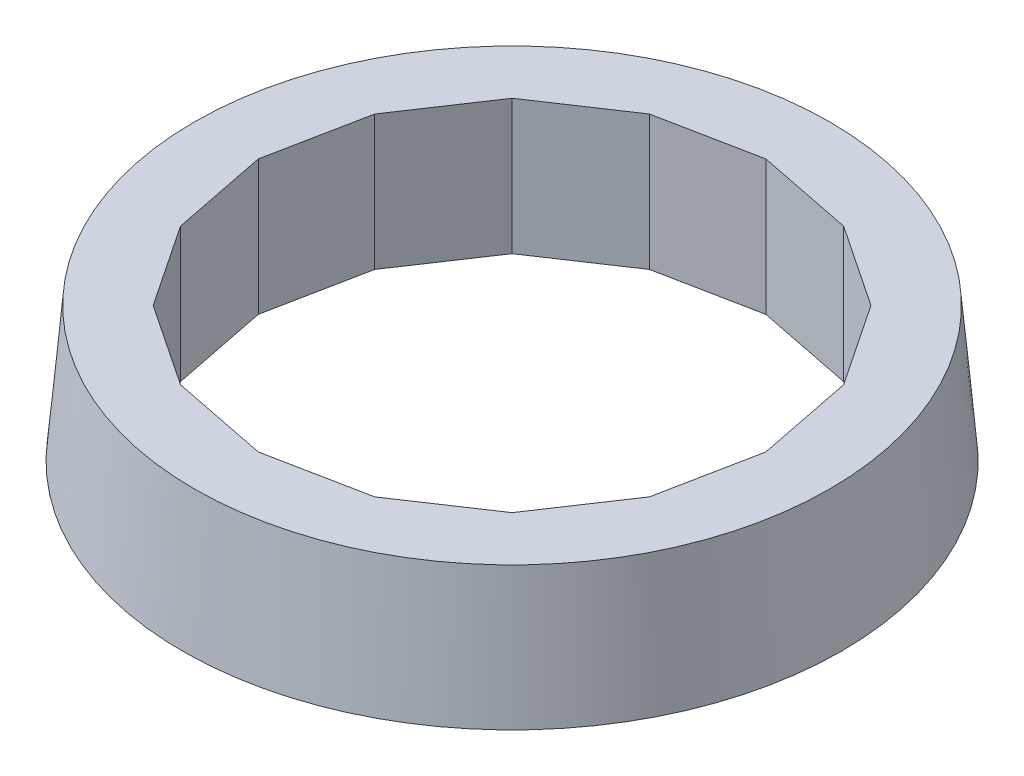
ISO-10303-21;
HEADER;
FILE_DESCRIPTION(('STEP AP214'),'2;1');
FILE_NAME('part.step','',(''),(''),'','','');
FILE_SCHEMA(('AUTOMOTIVE_DESIGN { 1 0 10303 214 1 1 1 1 }'));
ENDSEC;
DATA;
#1=APPLICATION_CONTEXT('core data for automotive mechanical design processes');
#2=APPLICATION_PROTOCOL_DEFINITION('international standard','automotive_design',2000,#1);
#3=PRODUCT_CONTEXT('',#1,'mechanical');
#4=PRODUCT('Part','Part','',(#3));
#5=PRODUCT_RELATED_PRODUCT_CATEGORY('part','',(#4));
#6=PRODUCT_DEFINITION_FORMATION('','',#4);
#7=PRODUCT_DEFINITION_CONTEXT('part definition',#1,'design');
#8=PRODUCT_DEFINITION('design','',#6,#7);
#9=PRODUCT_DEFINITION_SHAPE('','',#8);
#10=(LENGTH_UNIT() NAMED_UNIT(*) SI_UNIT(.MILLI.,.METRE.));
#11=(NAMED_UNIT(*) PLANE_ANGLE_UNIT() SI_UNIT($,.RADIAN.));
#12=(NAMED_UNIT(*) SI_UNIT($,.STERADIAN.) SOLID_ANGLE_UNIT());
#13=UNCERTAINTY_MEASURE_WITH_UNIT(LENGTH_MEASURE(1.E-05),#10,'distance_accuracy_value','');
#14=(GEOMETRIC_REPRESENTATION_CONTEXT(3) GLOBAL_UNCERTAINTY_ASSIGNED_CONTEXT((#13)) GLOBAL_UNIT_ASSIGNED_CONTEXT((#10,
#11,#12)) REPRESENTATION_CONTEXT('',''));
#15=CARTESIAN_POINT('',(0.,0.,0.));
#16=DIRECTION('',(0.,0.,1.));
#17=DIRECTION('',(1.,0.,0.));
#18=AXIS2_PLACEMENT_3D('',#15,#16,#17);
#19=CARTESIAN_POINT('',(0.,19.05,0.));
#20=DIRECTION('',(0.,1.,0.));
#21=DIRECTION('',(0.,0.,1.));
#22=AXIS2_PLACEMENT_3D('',#19,#20,#21);
#23=PLANE('',#22);
#24=DIRECTION('',(0.195090322016129,0.,0.98078528040323));
#25=VECTOR('',#24,1.);
#26=CARTESIAN_POINT('',(-35.9101329528706,19.05,0.));
#27=LINE('',#26,#25);
#28=CARTESIAN_POINT('',(-35.9101329528706,19.05,0.));
#29=VERTEX_POINT('',#28);
#30=CARTESIAN_POINT('',(-33.1766368449163,19.05,13.7422129350912));
#31=VERTEX_POINT('',#30);
#32=EDGE_CURVE('E155',#29,#31,#27,.T.);
#33=ORIENTED_EDGE('',*,*,#32,.F.);
#34=DIRECTION('',(-0.195090322016128,0.,0.980785280403231));
#35=VECTOR('',#34,1.);
#36=CARTESIAN_POINT('',(-33.1766368449163,19.05,-13.7422129350913));
#37=LINE('',#36,#35);
#38=CARTESIAN_POINT('',(-33.1766368449163,19.05,-13.7422129350913));
#39=VERTEX_POINT('',#38);
#40=EDGE_CURVE('E147',#39,#29,#37,.T.);
#41=ORIENTED_EDGE('',*,*,#40,.F.);
#42=DIRECTION('',(-0.555570233019603,0.,0.831469612302545));
#43=VECTOR('',#42,1.);
#44=CARTESIAN_POINT('',(-25.3922985242853,19.05,-25.3922985242853));
#45=LINE('',#44,#43);
#46=CARTESIAN_POINT('',(-25.3922985242853,19.05,-25.3922985242853));
#47=VERTEX_POINT('',#46);
#48=EDGE_CURVE('E196',#47,#39,#45,.T.);
#49=ORIENTED_EDGE('',*,*,#48,.F.);
#50=DIRECTION('',(-0.831469612302545,0.,0.555570233019602));
#51=VECTOR('',#50,1.);
#52=CARTESIAN_POINT('',(-13.7422129350912,19.05,-33.1766368449163));
#53=LINE('',#52,#51);
#54=CARTESIAN_POINT('',(-13.7422129350912,19.05,-33.1766368449163));
#55=VERTEX_POINT('',#54);
#56=EDGE_CURVE('E194',#55,#47,#53,.T.);
#57=ORIENTED_EDGE('',*,*,#56,.F.);
#58=DIRECTION('',(-0.98078528040323,0.,0.195090322016128));
#59=VECTOR('',#58,1.);
#60=CARTESIAN_POINT('',(0.,19.05,-35.9101329528706));
#61=LINE('',#60,#59);
#62=CARTESIAN_POINT('',(0.,19.05,-35.9101329528706));
#63=VERTEX_POINT('',#62);
#64=EDGE_CURVE('E192',#63,#55,#61,.T.);
#65=ORIENTED_EDGE('',*,*,#64,.F.);
#66=DIRECTION('',(-0.98078528040323,0.,-0.195090322016128));
#67=VECTOR('',#66,1.);
#68=CARTESIAN_POINT('',(13.7422129350912,19.05,-33.1766368449163));
#69=LINE('',#68,#67);
#70=CARTESIAN_POINT('',(13.7422129350912,19.05,-33.1766368449163));
#71=VERTEX_POINT('',#70);
#72=EDGE_CURVE('E190',#71,#63,#69,.T.);
#73=ORIENTED_EDGE('',*,*,#72,.F.);
#74=DIRECTION('',(-0.831469612302545,0.,-0.555570233019602));
#75=VECTOR('',#74,1.);
#76=CARTESIAN_POINT('',(25.3922985242853,19.05,-25.3922985242853));
#77=LINE('',#76,#75);
#78=CARTESIAN_POINT('',(25.3922985242853,19.05,-25.3922985242853));
#79=VERTEX_POINT('',#78);
#80=EDGE_CURVE('E188',#79,#71,#77,.T.);
#81=ORIENTED_EDGE('',*,*,#80,.F.);
#82=DIRECTION('',(-0.555570233019602,0.,-0.831469612302545));
#83=VECTOR('',#82,1.);
#84=CARTESIAN_POINT('',(33.1766368449163,19.05,-13.7422129350912));
#85=LINE('',#84,#83);
#86=CARTESIAN_POINT('',(33.1766368449163,19.05,-13.7422129350912));
#87=VERTEX_POINT('',#86);
#88=EDGE_CURVE('E186',#87,#79,#85,.T.);
#89=ORIENTED_EDGE('',*,*,#88,.F.);
#90=DIRECTION('',(-0.195090322016128,0.,-0.980785280403231));
#91=VECTOR('',#90,1.);
#92=CARTESIAN_POINT('',(35.9101329528706,19.05,0.));
#93=LINE('',#92,#91);
#94=CARTESIAN_POINT('',(35.9101329528706,19.05,0.));
#95=VERTEX_POINT('',#94);
#96=EDGE_CURVE('E184',#95,#87,#93,.T.);
#97=ORIENTED_EDGE('',*,*,#96,.F.);
#98=DIRECTION('',(0.195090322016128,0.,-0.980785280403231));
#99=VECTOR('',#98,1.);
#100=CARTESIAN_POINT('',(33.1766368449163,19.05,13.7422129350912));
#101=LINE('',#100,#99);
#102=CARTESIAN_POINT('',(33.1766368449163,19.05,13.7422129350912));
#103=VERTEX_POINT('',#102);
#104=EDGE_CURVE('E182',#103,#95,#101,.T.);
#105=ORIENTED_EDGE('',*,*,#104,.F.);
#106=DIRECTION('',(0.555570233019603,0.,-0.831469612302545));
#107=VECTOR('',#106,1.);
#108=CARTESIAN_POINT('',(25.3922985242853,19.05,25.3922985242853));
#109=LINE('',#108,#107);
#110=CARTESIAN_POINT('',(25.3922985242853,19.05,25.3922985242853));
#111=VERTEX_POINT('',#110);
#112=EDGE_CURVE('E180',#111,#103,#109,.T.);
#113=ORIENTED_EDGE('',*,*,#112,.F.);
#114=DIRECTION('',(0.831469612302545,0.,-0.555570233019603));
#115=VECTOR('',#114,1.);
#116=CARTESIAN_POINT('',(13.7422129350913,19.05,33.1766368449163));
#117=LINE('',#116,#115);
#118=CARTESIAN_POINT('',(13.7422129350913,19.05,33.1766368449163));
#119=VERTEX_POINT('',#118);
#120=EDGE_CURVE('E178',#119,#111,#117,.T.);
#121=ORIENTED_EDGE('',*,*,#120,.F.);
#122=DIRECTION('',(0.98078528040323,0.,-0.195090322016128));
#123=VECTOR('',#122,1.);
#124=CARTESIAN_POINT('',(0.,19.05,35.9101329528706));
#125=LINE('',#124,#123);
#126=CARTESIAN_POINT('',(0.,19.05,35.9101329528706));
#127=VERTEX_POINT('',#126);
#128=EDGE_CURVE('E176',#127,#119,#125,.T.);
#129=ORIENTED_EDGE('',*,*,#128,.F.);
#130=DIRECTION('',(0.980785280403231,0.,0.195090322016128));
#131=VECTOR('',#130,1.);
#132=CARTESIAN_POINT('',(-13.7422129350912,19.05,33.1766368449163));
#133=LINE('',#132,#131);
#134=CARTESIAN_POINT('',(-13.7422129350912,19.05,33.1766368449163));
#135=VERTEX_POINT('',#134);
#136=EDGE_CURVE('E174',#135,#127,#133,.T.);
#137=ORIENTED_EDGE('',*,*,#136,.F.);
#138=DIRECTION('',(0.831469612302545,0.,0.555570233019602));
#139=VECTOR('',#138,1.);
#140=CARTESIAN_POINT('',(-25.3922985242853,19.05,25.3922985242853));
#141=LINE('',#140,#139);
#142=CARTESIAN_POINT('',(-25.3922985242853,19.05,25.3922985242853));
#143=VERTEX_POINT('',#142);
#144=EDGE_CURVE('E169',#143,#135,#141,.T.);
#145=ORIENTED_EDGE('',*,*,#144,.F.);
#146=DIRECTION('',(0.555570233019602,0.,0.831469612302545));
#147=VECTOR('',#146,1.);
#148=CARTESIAN_POINT('',(-33.1766368449163,19.05,13.7422129350912));
#149=LINE('',#148,#147);
#150=EDGE_CURVE('E166',#31,#143,#149,.T.);
#151=ORIENTED_EDGE('',*,*,#150,.F.);
#152=EDGE_LOOP('',(#33,#41,#49,#57,#65,#73,#81,#89,#97,#105,#113,#121,#129,#137,#145,#151));
#153=FACE_BOUND('',#152,.T.);
#154=CARTESIAN_POINT('',(0.,19.05,0.));
#155=DIRECTION('',(0.,1.,0.));
#156=DIRECTION('',(0.,0.,1.));
#157=AXIS2_PLACEMENT_3D('',#154,#155,#156);
#158=CIRCLE('',#157,44.9700969892014);
#159=CARTESIAN_POINT('',(0.,19.05,44.9700969892013));
#160=VERTEX_POINT('',#159);
#161=EDGE_CURVE('E199',#160,#160,#158,.T.);
#162=ORIENTED_EDGE('',*,*,#161,.T.);
#163=EDGE_LOOP('',(#162));
#164=FACE_BOUND('',#163,.T.);
#165=ADVANCED_FACE('F35',(#153,#164),#23,.T.);
#166=CARTESIAN_POINT('',(0.,0.,0.));
#167=DIRECTION('',(0.,1.,0.));
#168=DIRECTION('',(0.,0.,1.));
#169=AXIS2_PLACEMENT_3D('',#166,#167,#168);
#170=PLANE('',#169);
#171=DIRECTION('',(-0.195090322016128,0.,0.980785280403231));
#172=VECTOR('',#171,1.);
#173=CARTESIAN_POINT('',(-33.1766368449163,0.,-13.7422129350913));
#174=LINE('',#173,#172);
#175=CARTESIAN_POINT('',(-33.1766368449163,0.,-13.7422129350913));
#176=VERTEX_POINT('',#175);
#177=CARTESIAN_POINT('',(-35.9101329528706,0.,0.));
#178=VERTEX_POINT('',#177);
#179=EDGE_CURVE('E57',#176,#178,#174,.T.);
#180=ORIENTED_EDGE('',*,*,#179,.T.);
#181=DIRECTION('',(0.195090322016129,0.,0.98078528040323));
#182=VECTOR('',#181,1.);
#183=CARTESIAN_POINT('',(-35.9101329528706,0.,0.));
#184=LINE('',#183,#182);
#185=CARTESIAN_POINT('',(-33.1766368449163,0.,13.7422129350912));
#186=VERTEX_POINT('',#185);
#187=EDGE_CURVE('E162',#178,#186,#184,.T.);
#188=ORIENTED_EDGE('',*,*,#187,.T.);
#189=DIRECTION('',(0.555570233019602,0.,0.831469612302545));
#190=VECTOR('',#189,1.);
#191=CARTESIAN_POINT('',(-33.1766368449163,0.,13.7422129350912));
#192=LINE('',#191,#190);
#193=CARTESIAN_POINT('',(-25.3922985242853,0.,25.3922985242853));
#194=VERTEX_POINT('',#193);
#195=EDGE_CURVE('E202',#186,#194,#192,.T.);
#196=ORIENTED_EDGE('',*,*,#195,.T.);
#197=DIRECTION('',(0.831469612302545,0.,0.555570233019602));
#198=VECTOR('',#197,1.);
#199=CARTESIAN_POINT('',(-25.3922985242853,0.,25.3922985242853));
#200=LINE('',#199,#198);
#201=CARTESIAN_POINT('',(-13.7422129350912,0.,33.1766368449163));
#202=VERTEX_POINT('',#201);
#203=EDGE_CURVE('E205',#194,#202,#200,.T.);
#204=ORIENTED_EDGE('',*,*,#203,.T.);
#205=DIRECTION('',(0.980785280403231,0.,0.195090322016128));
#206=VECTOR('',#205,1.);
#207=CARTESIAN_POINT('',(-13.7422129350912,0.,33.1766368449163));
#208=LINE('',#207,#206);
#209=CARTESIAN_POINT('',(0.,0.,35.9101329528706));
#210=VERTEX_POINT('',#209);
#211=EDGE_CURVE('E208',#202,#210,#208,.T.);
#212=ORIENTED_EDGE('',*,*,#211,.T.);
#213=DIRECTION('',(0.98078528040323,0.,-0.195090322016128));
#214=VECTOR('',#213,1.);
#215=CARTESIAN_POINT('',(0.,0.,35.9101329528706));
#216=LINE('',#215,#214);
#217=CARTESIAN_POINT('',(13.7422129350913,0.,33.1766368449163));
#218=VERTEX_POINT('',#217);
#219=EDGE_CURVE('E211',#210,#218,#216,.T.);
#220=ORIENTED_EDGE('',*,*,#219,.T.);
#221=DIRECTION('',(0.831469612302545,0.,-0.555570233019603));
#222=VECTOR('',#221,1.);
#223=CARTESIAN_POINT('',(13.7422129350913,0.,33.1766368449163));
#224=LINE('',#223,#222);
#225=CARTESIAN_POINT('',(25.3922985242853,0.,25.3922985242853));
#226=VERTEX_POINT('',#225);
#227=EDGE_CURVE('E215',#218,#226,#224,.T.);
#228=ORIENTED_EDGE('',*,*,#227,.T.);
#229=DIRECTION('',(0.555570233019603,0.,-0.831469612302545));
#230=VECTOR('',#229,1.);
#231=CARTESIAN_POINT('',(25.3922985242853,0.,25.3922985242853));
#232=LINE('',#231,#230);
#233=CARTESIAN_POINT('',(33.1766368449163,0.,13.7422129350912));
#234=VERTEX_POINT('',#233);
#235=EDGE_CURVE('E218',#226,#234,#232,.T.);
#236=ORIENTED_EDGE('',*,*,#235,.T.);
#237=DIRECTION('',(0.195090322016128,0.,-0.980785280403231));
#238=VECTOR('',#237,1.);
#239=CARTESIAN_POINT('',(33.1766368449163,0.,13.7422129350912));
#240=LINE('',#239,#238);
#241=CARTESIAN_POINT('',(35.9101329528706,0.,0.));
#242=VERTEX_POINT('',#241);
#243=EDGE_CURVE('E221',#234,#242,#240,.T.);
#244=ORIENTED_EDGE('',*,*,#243,.T.);
#245=DIRECTION('',(-0.195090322016128,0.,-0.980785280403231));
#246=VECTOR('',#245,1.);
#247=CARTESIAN_POINT('',(35.9101329528706,0.,0.));
#248=LINE('',#247,#246);
#249=CARTESIAN_POINT('',(33.1766368449163,0.,-13.7422129350912));
#250=VERTEX_POINT('',#249);
#251=EDGE_CURVE('E224',#242,#250,#248,.T.);
#252=ORIENTED_EDGE('',*,*,#251,.T.);
#253=DIRECTION('',(-0.555570233019602,0.,-0.831469612302545));
#254=VECTOR('',#253,1.);
#255=CARTESIAN_POINT('',(33.1766368449163,0.,-13.7422129350912));
#256=LINE('',#255,#254);
#257=CARTESIAN_POINT('',(25.3922985242853,0.,-25.3922985242853));
#258=VERTEX_POINT('',#257);
#259=EDGE_CURVE('E227',#250,#258,#256,.T.);
#260=ORIENTED_EDGE('',*,*,#259,.T.);
#261=DIRECTION('',(-0.831469612302545,0.,-0.555570233019602));
#262=VECTOR('',#261,1.);
#263=CARTESIAN_POINT('',(25.3922985242853,0.,-25.3922985242853));
#264=LINE('',#263,#262);
#265=CARTESIAN_POINT('',(13.7422129350912,0.,-33.1766368449163));
#266=VERTEX_POINT('',#265);
#267=EDGE_CURVE('E230',#258,#266,#264,.T.);
#268=ORIENTED_EDGE('',*,*,#267,.T.);
#269=DIRECTION('',(-0.98078528040323,0.,-0.195090322016128));
#270=VECTOR('',#269,1.);
#271=CARTESIAN_POINT('',(13.7422129350912,0.,-33.1766368449163));
#272=LINE('',#271,#270);
#273=CARTESIAN_POINT('',(0.,0.,-35.9101329528706));
#274=VERTEX_POINT('',#273);
#275=EDGE_CURVE('E233',#266,#274,#272,.T.);
#276=ORIENTED_EDGE('',*,*,#275,.T.);
#277=DIRECTION('',(-0.98078528040323,0.,0.195090322016128));
#278=VECTOR('',#277,1.);
#279=CARTESIAN_POINT('',(0.,0.,-35.9101329528706));
#280=LINE('',#279,#278);
#281=CARTESIAN_POINT('',(-13.7422129350912,0.,-33.1766368449163));
#282=VERTEX_POINT('',#281);
#283=EDGE_CURVE('E236',#274,#282,#280,.T.);
#284=ORIENTED_EDGE('',*,*,#283,.T.);
#285=DIRECTION('',(-0.831469612302545,0.,0.555570233019602));
#286=VECTOR('',#285,1.);
#287=CARTESIAN_POINT('',(-13.7422129350912,0.,-33.1766368449163));
#288=LINE('',#287,#286);
#289=CARTESIAN_POINT('',(-25.3922985242853,0.,-25.3922985242853));
#290=VERTEX_POINT('',#289);
#291=EDGE_CURVE('E239',#282,#290,#288,.T.);
#292=ORIENTED_EDGE('',*,*,#291,.T.);
#293=DIRECTION('',(-0.555570233019603,0.,0.831469612302545));
#294=VECTOR('',#293,1.);
#295=CARTESIAN_POINT('',(-25.3922985242853,0.,-25.3922985242853));
#296=LINE('',#295,#294);
#297=EDGE_CURVE('E156',#290,#176,#296,.T.);
#298=ORIENTED_EDGE('',*,*,#297,.T.);
#299=EDGE_LOOP('',(#180,#188,#196,#204,#212,#220,#228,#236,#244,#252,#260,#268,#276,#284,#292,#298));
#300=FACE_BOUND('',#299,.T.);
#301=CARTESIAN_POINT('',(0.,-1.25756628499238E-13,0.));
#302=DIRECTION('',(0.,-1.,0.));
#303=DIRECTION('',(1.,0.,0.));
#304=AXIS2_PLACEMENT_3D('',#301,#302,#303);
#305=CIRCLE('',#304,46.6367560293701);
#306=CARTESIAN_POINT('',(46.6367560293701,-2.45300128682024E-13,0.));
#307=VERTEX_POINT('',#306);
#308=EDGE_CURVE('E488',#307,#307,#305,.T.);
#309=ORIENTED_EDGE('',*,*,#308,.T.);
#310=EDGE_LOOP('',(#309));
#311=FACE_BOUND('',#310,.T.);
#312=ADVANCED_FACE('F37',(#300,#311),#170,.F.);
#313=CARTESIAN_POINT('',(-33.1766368449163,19.05,-13.7422129350913));
#314=DIRECTION('',(0.980785280403231,0.,0.195090322016128));
#315=DIRECTION('',(0.195090322016128,0.,-0.980785280403231));
#316=AXIS2_PLACEMENT_3D('',#313,#314,#315);
#317=PLANE('',#316);
#318=ORIENTED_EDGE('',*,*,#179,.F.);
#319=DIRECTION('',(0.,-1.,0.));
#320=VECTOR('',#319,1.);
#321=CARTESIAN_POINT('',(-33.1766368449163,19.05,-13.7422129350913));
#322=LINE('',#321,#320);
#323=EDGE_CURVE('E150',#39,#176,#322,.T.);
#324=ORIENTED_EDGE('',*,*,#323,.F.);
#325=ORIENTED_EDGE('',*,*,#40,.T.);
#326=DIRECTION('',(0.,-1.,0.));
#327=VECTOR('',#326,1.);
#328=CARTESIAN_POINT('',(-35.9101329528706,19.05,0.));
#329=LINE('',#328,#327);
#330=EDGE_CURVE('E11',#29,#178,#329,.T.);
#331=ORIENTED_EDGE('',*,*,#330,.T.);
#332=EDGE_LOOP('',(#318,#324,#325,#331));
#333=FACE_BOUND('',#332,.T.);
#334=ADVANCED_FACE('F149',(#333),#317,.T.);
#335=CARTESIAN_POINT('',(-35.9101329528706,19.05,0.));
#336=DIRECTION('',(0.98078528040323,0.,-0.195090322016129));
#337=DIRECTION('',(-0.195090322016129,0.,-0.98078528040323));
#338=AXIS2_PLACEMENT_3D('',#335,#336,#337);
#339=PLANE('',#338);
#340=ORIENTED_EDGE('',*,*,#187,.F.);
#341=ORIENTED_EDGE('',*,*,#330,.F.);
#342=ORIENTED_EDGE('',*,*,#32,.T.);
#343=DIRECTION('',(0.,-1.,0.));
#344=VECTOR('',#343,1.);
#345=CARTESIAN_POINT('',(-33.1766368449163,19.05,13.7422129350912));
#346=LINE('',#345,#344);
#347=EDGE_CURVE('E43',#31,#186,#346,.T.);
#348=ORIENTED_EDGE('',*,*,#347,.T.);
#349=EDGE_LOOP('',(#340,#341,#342,#348));
#350=FACE_BOUND('',#349,.T.);
#351=ADVANCED_FACE('F159',(#350),#339,.T.);
#352=CARTESIAN_POINT('',(-33.1766368449163,19.05,13.7422129350912));
#353=DIRECTION('',(0.831469612302545,0.,-0.555570233019602));
#354=DIRECTION('',(-0.555570233019602,0.,-0.831469612302545));
#355=AXIS2_PLACEMENT_3D('',#352,#353,#354);
#356=PLANE('',#355);
#357=ORIENTED_EDGE('',*,*,#195,.F.);
#358=ORIENTED_EDGE('',*,*,#347,.F.);
#359=ORIENTED_EDGE('',*,*,#150,.T.);
#360=DIRECTION('',(0.,-1.,0.));
#361=VECTOR('',#360,1.);
#362=CARTESIAN_POINT('',(-25.3922985242853,19.05,25.3922985242853));
#363=LINE('',#362,#361);
#364=EDGE_CURVE('E268',#143,#194,#363,.T.);
#365=ORIENTED_EDGE('',*,*,#364,.T.);
#366=EDGE_LOOP('',(#357,#358,#359,#365));
#367=FACE_BOUND('',#366,.T.);
#368=ADVANCED_FACE('F271',(#367),#356,.T.);
#369=CARTESIAN_POINT('',(-25.3922985242853,19.05,25.3922985242853));
#370=DIRECTION('',(0.555570233019602,0.,-0.831469612302545));
#371=DIRECTION('',(-0.831469612302545,0.,-0.555570233019602));
#372=AXIS2_PLACEMENT_3D('',#369,#370,#371);
#373=PLANE('',#372);
#374=ORIENTED_EDGE('',*,*,#203,.F.);
#375=ORIENTED_EDGE('',*,*,#364,.F.);
#376=ORIENTED_EDGE('',*,*,#144,.T.);
#377=DIRECTION('',(0.,-1.,0.));
#378=VECTOR('',#377,1.);
#379=CARTESIAN_POINT('',(-13.7422129350912,19.05,33.1766368449163));
#380=LINE('',#379,#378);
#381=EDGE_CURVE('E266',#135,#202,#380,.T.);
#382=ORIENTED_EDGE('',*,*,#381,.T.);
#383=EDGE_LOOP('',(#374,#375,#376,#382));
#384=FACE_BOUND('',#383,.T.);
#385=ADVANCED_FACE('F333',(#384),#373,.T.);
#386=CARTESIAN_POINT('',(-13.7422129350912,19.05,33.1766368449163));
#387=DIRECTION('',(0.195090322016128,0.,-0.98078528040323));
#388=DIRECTION('',(-0.98078528040323,0.,-0.195090322016128));
#389=AXIS2_PLACEMENT_3D('',#386,#387,#388);
#390=PLANE('',#389);
#391=ORIENTED_EDGE('',*,*,#211,.F.);
#392=ORIENTED_EDGE('',*,*,#381,.F.);
#393=ORIENTED_EDGE('',*,*,#136,.T.);
#394=DIRECTION('',(0.,-1.,0.));
#395=VECTOR('',#394,1.);
#396=CARTESIAN_POINT('',(0.,19.05,35.9101329528706));
#397=LINE('',#396,#395);
#398=EDGE_CURVE('E264',#127,#210,#397,.T.);
#399=ORIENTED_EDGE('',*,*,#398,.T.);
#400=EDGE_LOOP('',(#391,#392,#393,#399));
#401=FACE_BOUND('',#400,.T.);
#402=ADVANCED_FACE('F330',(#401),#390,.T.);
#403=CARTESIAN_POINT('',(0.,19.05,35.9101329528706));
#404=DIRECTION('',(-0.195090322016128,0.,-0.98078528040323));
#405=DIRECTION('',(-0.98078528040323,0.,0.195090322016128));
#406=AXIS2_PLACEMENT_3D('',#403,#404,#405);
#407=PLANE('',#406);
#408=ORIENTED_EDGE('',*,*,#219,.F.);
#409=ORIENTED_EDGE('',*,*,#398,.F.);
#410=ORIENTED_EDGE('',*,*,#128,.T.);
#411=DIRECTION('',(0.,-1.,0.));
#412=VECTOR('',#411,1.);
#413=CARTESIAN_POINT('',(13.7422129350913,19.05,33.1766368449163));
#414=LINE('',#413,#412);
#415=EDGE_CURVE('E262',#119,#218,#414,.T.);
#416=ORIENTED_EDGE('',*,*,#415,.T.);
#417=EDGE_LOOP('',(#408,#409,#410,#416));
#418=FACE_BOUND('',#417,.T.);
#419=ADVANCED_FACE('F327',(#418),#407,.T.);
#420=CARTESIAN_POINT('',(13.7422129350913,19.05,33.1766368449163));
#421=DIRECTION('',(-0.555570233019603,0.,-0.831469612302545));
#422=DIRECTION('',(-0.831469612302545,0.,0.555570233019603));
#423=AXIS2_PLACEMENT_3D('',#420,#421,#422);
#424=PLANE('',#423);
#425=ORIENTED_EDGE('',*,*,#227,.F.);
#426=ORIENTED_EDGE('',*,*,#415,.F.);
#427=ORIENTED_EDGE('',*,*,#120,.T.);
#428=DIRECTION('',(0.,-1.,0.));
#429=VECTOR('',#428,1.);
#430=CARTESIAN_POINT('',(25.3922985242853,19.05,25.3922985242853));
#431=LINE('',#430,#429);
#432=EDGE_CURVE('E260',#111,#226,#431,.T.);
#433=ORIENTED_EDGE('',*,*,#432,.T.);
#434=EDGE_LOOP('',(#425,#426,#427,#433));
#435=FACE_BOUND('',#434,.T.);
#436=ADVANCED_FACE('F320',(#435),#424,.T.);
#437=CARTESIAN_POINT('',(25.3922985242853,19.05,25.3922985242853));
#438=DIRECTION('',(-0.831469612302545,0.,-0.555570233019602));
#439=DIRECTION('',(-0.555570233019602,0.,0.831469612302545));
#440=AXIS2_PLACEMENT_3D('',#437,#438,#439);
#441=PLANE('',#440);
#442=ORIENTED_EDGE('',*,*,#235,.F.);
#443=ORIENTED_EDGE('',*,*,#432,.F.);
#444=ORIENTED_EDGE('',*,*,#112,.T.);
#445=DIRECTION('',(0.,-1.,0.));
#446=VECTOR('',#445,1.);
#447=CARTESIAN_POINT('',(33.1766368449163,19.05,13.7422129350912));
#448=LINE('',#447,#446);
#449=EDGE_CURVE('E258',#103,#234,#448,.T.);
#450=ORIENTED_EDGE('',*,*,#449,.T.);
#451=EDGE_LOOP('',(#442,#443,#444,#450));
#452=FACE_BOUND('',#451,.T.);
#453=ADVANCED_FACE('F316',(#452),#441,.T.);
#454=CARTESIAN_POINT('',(33.1766368449163,19.05,13.7422129350912));
#455=DIRECTION('',(-0.980785280403231,0.,-0.195090322016128));
#456=DIRECTION('',(-0.195090322016128,0.,0.980785280403231));
#457=AXIS2_PLACEMENT_3D('',#454,#455,#456);
#458=PLANE('',#457);
#459=ORIENTED_EDGE('',*,*,#243,.F.);
#460=ORIENTED_EDGE('',*,*,#449,.F.);
#461=ORIENTED_EDGE('',*,*,#104,.T.);
#462=DIRECTION('',(0.,-1.,0.));
#463=VECTOR('',#462,1.);
#464=CARTESIAN_POINT('',(35.9101329528706,19.05,0.));
#465=LINE('',#464,#463);
#466=EDGE_CURVE('E256',#95,#242,#465,.T.);
#467=ORIENTED_EDGE('',*,*,#466,.T.);
#468=EDGE_LOOP('',(#459,#460,#461,#467));
#469=FACE_BOUND('',#468,.T.);
#470=ADVANCED_FACE('F313',(#469),#458,.T.);
#471=CARTESIAN_POINT('',(35.9101329528706,19.05,0.));
#472=DIRECTION('',(-0.98078528040323,0.,0.195090322016128));
#473=DIRECTION('',(0.195090322016128,0.,0.98078528040323));
#474=AXIS2_PLACEMENT_3D('',#471,#472,#473);
#475=PLANE('',#474);
#476=ORIENTED_EDGE('',*,*,#251,.F.);
#477=ORIENTED_EDGE('',*,*,#466,.F.);
#478=ORIENTED_EDGE('',*,*,#96,.T.);
#479=DIRECTION('',(0.,-1.,0.));
#480=VECTOR('',#479,1.);
#481=CARTESIAN_POINT('',(33.1766368449163,19.05,-13.7422129350912));
#482=LINE('',#481,#480);
#483=EDGE_CURVE('E254',#87,#250,#482,.T.);
#484=ORIENTED_EDGE('',*,*,#483,.T.);
#485=EDGE_LOOP('',(#476,#477,#478,#484));
#486=FACE_BOUND('',#485,.T.);
#487=ADVANCED_FACE('F305',(#486),#475,.T.);
#488=CARTESIAN_POINT('',(33.1766368449163,19.05,-13.7422129350912));
#489=DIRECTION('',(-0.831469612302545,0.,0.555570233019602));
#490=DIRECTION('',(0.555570233019602,0.,0.831469612302545));
#491=AXIS2_PLACEMENT_3D('',#488,#489,#490);
#492=PLANE('',#491);
#493=ORIENTED_EDGE('',*,*,#259,.F.);
#494=ORIENTED_EDGE('',*,*,#483,.F.);
#495=ORIENTED_EDGE('',*,*,#88,.T.);
#496=DIRECTION('',(0.,-1.,0.));
#497=VECTOR('',#496,1.);
#498=CARTESIAN_POINT('',(25.3922985242853,19.05,-25.3922985242853));
#499=LINE('',#498,#497);
#500=EDGE_CURVE('E252',#79,#258,#499,.T.);
#501=ORIENTED_EDGE('',*,*,#500,.T.);
#502=EDGE_LOOP('',(#493,#494,#495,#501));
#503=FACE_BOUND('',#502,.T.);
#504=ADVANCED_FACE('F301',(#503),#492,.T.);
#505=CARTESIAN_POINT('',(25.3922985242853,19.05,-25.3922985242853));
#506=DIRECTION('',(-0.555570233019602,0.,0.831469612302545));
#507=DIRECTION('',(0.831469612302545,0.,0.555570233019602));
#508=AXIS2_PLACEMENT_3D('',#505,#506,#507);
#509=PLANE('',#508);
#510=ORIENTED_EDGE('',*,*,#267,.F.);
#511=ORIENTED_EDGE('',*,*,#500,.F.);
#512=ORIENTED_EDGE('',*,*,#80,.T.);
#513=DIRECTION('',(0.,-1.,0.));
#514=VECTOR('',#513,1.);
#515=CARTESIAN_POINT('',(13.7422129350912,19.05,-33.1766368449163));
#516=LINE('',#515,#514);
#517=EDGE_CURVE('E250',#71,#266,#516,.T.);
#518=ORIENTED_EDGE('',*,*,#517,.T.);
#519=EDGE_LOOP('',(#510,#511,#512,#518));
#520=FACE_BOUND('',#519,.T.);
#521=ADVANCED_FACE('F298',(#520),#509,.T.);
#522=CARTESIAN_POINT('',(13.7422129350912,19.05,-33.1766368449163));
#523=DIRECTION('',(-0.195090322016128,0.,0.980785280403231));
#524=DIRECTION('',(0.98078528040323,0.,0.195090322016128));
#525=AXIS2_PLACEMENT_3D('',#522,#523,#524);
#526=PLANE('',#525);
#527=ORIENTED_EDGE('',*,*,#275,.F.);
#528=ORIENTED_EDGE('',*,*,#517,.F.);
#529=ORIENTED_EDGE('',*,*,#72,.T.);
#530=DIRECTION('',(0.,-1.,0.));
#531=VECTOR('',#530,1.);
#532=CARTESIAN_POINT('',(0.,19.05,-35.9101329528706));
#533=LINE('',#532,#531);
#534=EDGE_CURVE('E248',#63,#274,#533,.T.);
#535=ORIENTED_EDGE('',*,*,#534,.T.);
#536=EDGE_LOOP('',(#527,#528,#529,#535));
#537=FACE_BOUND('',#536,.T.);
#538=ADVANCED_FACE('F290',(#537),#526,.T.);
#539=CARTESIAN_POINT('',(0.,19.05,-35.9101329528706));
#540=DIRECTION('',(0.195090322016128,0.,0.980785280403231));
#541=DIRECTION('',(0.98078528040323,0.,-0.195090322016128));
#542=AXIS2_PLACEMENT_3D('',#539,#540,#541);
#543=PLANE('',#542);
#544=ORIENTED_EDGE('',*,*,#283,.F.);
#545=ORIENTED_EDGE('',*,*,#534,.F.);
#546=ORIENTED_EDGE('',*,*,#64,.T.);
#547=DIRECTION('',(0.,-1.,0.));
#548=VECTOR('',#547,1.);
#549=CARTESIAN_POINT('',(-13.7422129350912,19.05,-33.1766368449163));
#550=LINE('',#549,#548);
#551=EDGE_CURVE('E246',#55,#282,#550,.T.);
#552=ORIENTED_EDGE('',*,*,#551,.T.);
#553=EDGE_LOOP('',(#544,#545,#546,#552));
#554=FACE_BOUND('',#553,.T.);
#555=ADVANCED_FACE('F286',(#554),#543,.T.);
#556=CARTESIAN_POINT('',(-13.7422129350912,19.05,-33.1766368449163));
#557=DIRECTION('',(0.555570233019602,0.,0.831469612302545));
#558=DIRECTION('',(0.831469612302545,0.,-0.555570233019602));
#559=AXIS2_PLACEMENT_3D('',#556,#557,#558);
#560=PLANE('',#559);
#561=ORIENTED_EDGE('',*,*,#291,.F.);
#562=ORIENTED_EDGE('',*,*,#551,.F.);
#563=ORIENTED_EDGE('',*,*,#56,.T.);
#564=DIRECTION('',(0.,-1.,0.));
#565=VECTOR('',#564,1.);
#566=CARTESIAN_POINT('',(-25.3922985242853,19.05,-25.3922985242853));
#567=LINE('',#566,#565);
#568=EDGE_CURVE('E50',#47,#290,#567,.T.);
#569=ORIENTED_EDGE('',*,*,#568,.T.);
#570=EDGE_LOOP('',(#561,#562,#563,#569));
#571=FACE_BOUND('',#570,.T.);
#572=ADVANCED_FACE('F283',(#571),#560,.T.);
#573=CARTESIAN_POINT('',(-25.3922985242853,19.05,-25.3922985242853));
#574=DIRECTION('',(0.831469612302545,0.,0.555570233019603));
#575=DIRECTION('',(0.555570233019603,0.,-0.831469612302545));
#576=AXIS2_PLACEMENT_3D('',#573,#574,#575);
#577=PLANE('',#576);
#578=ORIENTED_EDGE('',*,*,#297,.F.);
#579=ORIENTED_EDGE('',*,*,#568,.F.);
#580=ORIENTED_EDGE('',*,*,#48,.T.);
#581=ORIENTED_EDGE('',*,*,#323,.T.);
#582=EDGE_LOOP('',(#578,#579,#580,#581));
#583=FACE_BOUND('',#582,.T.);
#584=ADVANCED_FACE('F277',(#583),#577,.T.);
#585=CARTESIAN_POINT('',(0.,-1.25756628499238E-13,0.));
#586=DIRECTION('',(0.,-1.,0.));
#587=DIRECTION('',(1.,0.,0.));
#588=AXIS2_PLACEMENT_3D('',#585,#586,#587);
#589=CONICAL_SURFACE('',#588,46.6367560293701,0.0872664625997103);
#590=ORIENTED_EDGE('',*,*,#161,.F.);
#591=EDGE_LOOP('',(#590));
#592=FACE_BOUND('',#591,.T.);
#593=ORIENTED_EDGE('',*,*,#308,.F.);
#594=EDGE_LOOP('',(#593));
#595=FACE_BOUND('',#594,.T.);
#596=ADVANCED_FACE('F457',(#592,#595),#589,.T.);
#597=CLOSED_SHELL('',(#165,#312,#334,#351,#368,#385,#402,#419,#436,#453,#470,#487,#504,#521,
#538,#555,#572,#584,#596));
#598=MANIFOLD_SOLID_BREP('B2',#597);
#599=ADVANCED_BREP_SHAPE_REPRESENTATION('',(#18,#598),#14);
#600=SHAPE_DEFINITION_REPRESENTATION(#9,#599);
ENDSEC;
END-ISO-10303-21;
